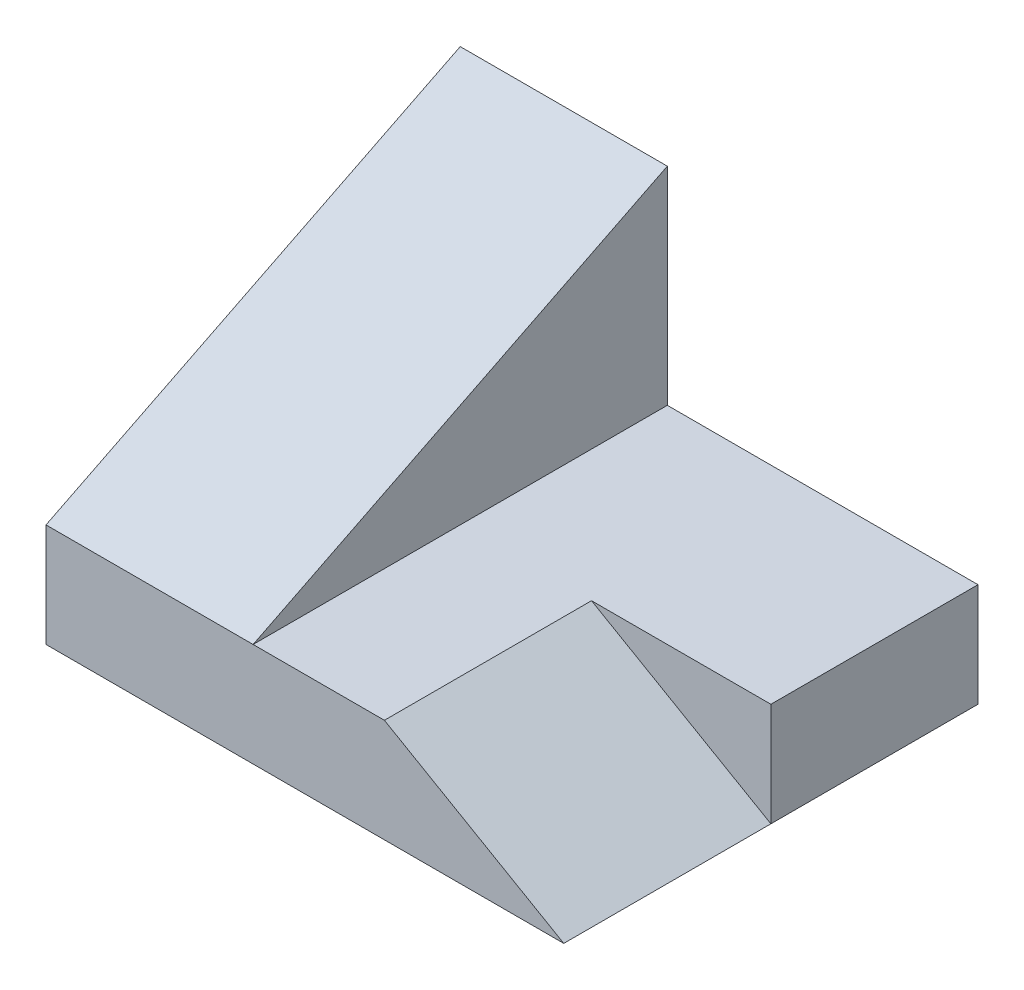
ISO-10303-21;
HEADER;
FILE_DESCRIPTION(('STEP AP214'),'2;1');
FILE_NAME('part.step','',(''),(''),'','','');
FILE_SCHEMA(('AUTOMOTIVE_DESIGN { 1 0 10303 214 1 1 1 1 }'));
ENDSEC;
DATA;
#1=APPLICATION_CONTEXT('core data for automotive mechanical design processes');
#2=APPLICATION_PROTOCOL_DEFINITION('international standard','automotive_design',2000,#1);
#3=PRODUCT_CONTEXT('',#1,'mechanical');
#4=PRODUCT('Part','Part','',(#3));
#5=PRODUCT_RELATED_PRODUCT_CATEGORY('part','',(#4));
#6=PRODUCT_DEFINITION_FORMATION('','',#4);
#7=PRODUCT_DEFINITION_CONTEXT('part definition',#1,'design');
#8=PRODUCT_DEFINITION('design','',#6,#7);
#9=PRODUCT_DEFINITION_SHAPE('','',#8);
#10=(LENGTH_UNIT() NAMED_UNIT(*) SI_UNIT(.MILLI.,.METRE.));
#11=(NAMED_UNIT(*) PLANE_ANGLE_UNIT() SI_UNIT($,.RADIAN.));
#12=(NAMED_UNIT(*) SI_UNIT($,.STERADIAN.) SOLID_ANGLE_UNIT());
#13=UNCERTAINTY_MEASURE_WITH_UNIT(LENGTH_MEASURE(1.E-05),#10,'distance_accuracy_value','');
#14=(GEOMETRIC_REPRESENTATION_CONTEXT(3) GLOBAL_UNCERTAINTY_ASSIGNED_CONTEXT((#13)) GLOBAL_UNIT_ASSIGNED_CONTEXT((#10,
#11,#12)) REPRESENTATION_CONTEXT('',''));
#15=CARTESIAN_POINT('',(0.,0.,0.));
#16=DIRECTION('',(0.,0.,1.));
#17=DIRECTION('',(1.,0.,0.));
#18=AXIS2_PLACEMENT_3D('',#15,#16,#17);
#19=CARTESIAN_POINT('',(25.,10.,-20.));
#20=DIRECTION('',(-1.,0.,0.));
#21=DIRECTION('',(0.,0.,1.));
#22=AXIS2_PLACEMENT_3D('',#19,#20,#21);
#23=PLANE('',#22);
#24=DIRECTION('',(0.,1.,0.));
#25=VECTOR('',#24,1.);
#26=CARTESIAN_POINT('',(25.,10.,0.));
#27=LINE('',#26,#25);
#28=CARTESIAN_POINT('',(25.,0.,0.));
#29=VERTEX_POINT('',#28);
#30=CARTESIAN_POINT('',(25.,10.,0.));
#31=VERTEX_POINT('',#30);
#32=EDGE_CURVE('E115',#29,#31,#27,.T.);
#33=ORIENTED_EDGE('',*,*,#32,.F.);
#34=DIRECTION('',(0.,0.,-1.));
#35=VECTOR('',#34,1.);
#36=CARTESIAN_POINT('',(25.,0.,-20.));
#37=LINE('',#36,#35);
#38=CARTESIAN_POINT('',(25.,0.,-20.));
#39=VERTEX_POINT('',#38);
#40=EDGE_CURVE('E105',#29,#39,#37,.T.);
#41=ORIENTED_EDGE('',*,*,#40,.T.);
#42=DIRECTION('',(0.,-1.,0.));
#43=VECTOR('',#42,1.);
#44=CARTESIAN_POINT('',(25.,10.,-20.));
#45=LINE('',#44,#43);
#46=CARTESIAN_POINT('',(25.,10.,-20.));
#47=VERTEX_POINT('',#46);
#48=EDGE_CURVE('E11',#47,#39,#45,.T.);
#49=ORIENTED_EDGE('',*,*,#48,.F.);
#50=DIRECTION('',(0.,0.,-1.));
#51=VECTOR('',#50,1.);
#52=CARTESIAN_POINT('',(25.,10.,-20.));
#53=LINE('',#52,#51);
#54=EDGE_CURVE('E52',#31,#47,#53,.T.);
#55=ORIENTED_EDGE('',*,*,#54,.F.);
#56=EDGE_LOOP('',(#33,#41,#49,#55));
#57=FACE_BOUND('',#56,.T.);
#58=ADVANCED_FACE('F37',(#57),#23,.F.);
#59=CARTESIAN_POINT('',(-25.,10.,-20.));
#60=DIRECTION('',(0.,0.,1.));
#61=DIRECTION('',(1.,0.,0.));
#62=AXIS2_PLACEMENT_3D('',#59,#60,#61);
#63=PLANE('',#62);
#64=DIRECTION('',(-1.,0.,0.));
#65=VECTOR('',#64,1.);
#66=CARTESIAN_POINT('',(-25.,0.,-20.));
#67=LINE('',#66,#65);
#68=CARTESIAN_POINT('',(-25.,0.,-20.));
#69=VERTEX_POINT('',#68);
#70=EDGE_CURVE('E93',#39,#69,#67,.T.);
#71=ORIENTED_EDGE('',*,*,#70,.T.);
#72=DIRECTION('',(0.,-1.,0.));
#73=VECTOR('',#72,1.);
#74=CARTESIAN_POINT('',(-25.,10.,-20.));
#75=LINE('',#74,#73);
#76=CARTESIAN_POINT('',(-25.,30.,-20.));
#77=VERTEX_POINT('',#76);
#78=EDGE_CURVE('E45',#77,#69,#75,.T.);
#79=ORIENTED_EDGE('',*,*,#78,.F.);
#80=DIRECTION('',(-1.,0.,0.));
#81=VECTOR('',#80,1.);
#82=CARTESIAN_POINT('',(-25.,30.,-20.));
#83=LINE('',#82,#81);
#84=CARTESIAN_POINT('',(-5.,30.,-20.));
#85=VERTEX_POINT('',#84);
#86=EDGE_CURVE('E126',#85,#77,#83,.T.);
#87=ORIENTED_EDGE('',*,*,#86,.F.);
#88=DIRECTION('',(0.,-1.,0.));
#89=VECTOR('',#88,1.);
#90=CARTESIAN_POINT('',(-5.,30.,-20.));
#91=LINE('',#90,#89);
#92=CARTESIAN_POINT('',(-5.,10.,-20.));
#93=VERTEX_POINT('',#92);
#94=EDGE_CURVE('E116',#85,#93,#91,.T.);
#95=ORIENTED_EDGE('',*,*,#94,.T.);
#96=DIRECTION('',(-1.,0.,0.));
#97=VECTOR('',#96,1.);
#98=CARTESIAN_POINT('',(-25.,10.,-20.));
#99=LINE('',#98,#97);
#100=EDGE_CURVE('E100',#47,#93,#99,.T.);
#101=ORIENTED_EDGE('',*,*,#100,.F.);
#102=ORIENTED_EDGE('',*,*,#48,.T.);
#103=EDGE_LOOP('',(#71,#79,#87,#95,#101,#102));
#104=FACE_BOUND('',#103,.T.);
#105=ADVANCED_FACE('F144',(#104),#63,.F.);
#106=CARTESIAN_POINT('',(-25.,10.,-20.));
#107=DIRECTION('',(1.,0.,0.));
#108=DIRECTION('',(0.,0.,-1.));
#109=AXIS2_PLACEMENT_3D('',#106,#107,#108);
#110=PLANE('',#109);
#111=DIRECTION('',(0.,-1.,0.));
#112=VECTOR('',#111,1.);
#113=CARTESIAN_POINT('',(-25.,10.,20.));
#114=LINE('',#113,#112);
#115=CARTESIAN_POINT('',(-25.,10.,20.));
#116=VERTEX_POINT('',#115);
#117=CARTESIAN_POINT('',(-25.,0.,20.));
#118=VERTEX_POINT('',#117);
#119=EDGE_CURVE('E71',#116,#118,#114,.T.);
#120=ORIENTED_EDGE('',*,*,#119,.F.);
#121=DIRECTION('',(0.,0.447213595499958,-0.894427190999916));
#122=VECTOR('',#121,1.);
#123=CARTESIAN_POINT('',(-25.,30.,-20.));
#124=LINE('',#123,#122);
#125=EDGE_CURVE('E133',#116,#77,#124,.T.);
#126=ORIENTED_EDGE('',*,*,#125,.T.);
#127=ORIENTED_EDGE('',*,*,#78,.T.);
#128=DIRECTION('',(0.,0.,1.));
#129=VECTOR('',#128,1.);
#130=CARTESIAN_POINT('',(-25.,0.,-20.));
#131=LINE('',#130,#129);
#132=EDGE_CURVE('E88',#69,#118,#131,.T.);
#133=ORIENTED_EDGE('',*,*,#132,.T.);
#134=EDGE_LOOP('',(#120,#126,#127,#133));
#135=FACE_BOUND('',#134,.T.);
#136=ADVANCED_FACE('F89',(#135),#110,.F.);
#137=CARTESIAN_POINT('',(-25.,10.,20.));
#138=DIRECTION('',(0.,0.,-1.));
#139=DIRECTION('',(-1.,0.,0.));
#140=AXIS2_PLACEMENT_3D('',#137,#138,#139);
#141=PLANE('',#140);
#142=DIRECTION('',(1.,0.,0.));
#143=VECTOR('',#142,1.);
#144=CARTESIAN_POINT('',(-25.,10.,20.));
#145=LINE('',#144,#143);
#146=CARTESIAN_POINT('',(-5.,10.,20.));
#147=VERTEX_POINT('',#146);
#148=CARTESIAN_POINT('',(7.67949192431123,10.,20.));
#149=VERTEX_POINT('',#148);
#150=EDGE_CURVE('E84',#147,#149,#145,.T.);
#151=ORIENTED_EDGE('',*,*,#150,.F.);
#152=DIRECTION('',(1.,0.,0.));
#153=VECTOR('',#152,1.);
#154=CARTESIAN_POINT('',(-25.,10.,20.));
#155=LINE('',#154,#153);
#156=EDGE_CURVE('E81',#116,#147,#155,.T.);
#157=ORIENTED_EDGE('',*,*,#156,.F.);
#158=ORIENTED_EDGE('',*,*,#119,.T.);
#159=DIRECTION('',(1.,0.,0.));
#160=VECTOR('',#159,1.);
#161=CARTESIAN_POINT('',(-25.,0.,20.));
#162=LINE('',#161,#160);
#163=CARTESIAN_POINT('',(25.,0.,20.));
#164=VERTEX_POINT('',#163);
#165=EDGE_CURVE('E77',#118,#164,#162,.T.);
#166=ORIENTED_EDGE('',*,*,#165,.T.);
#167=DIRECTION('',(0.866025403784439,-0.5,0.));
#168=VECTOR('',#167,1.);
#169=CARTESIAN_POINT('',(25.,0.,20.));
#170=LINE('',#169,#168);
#171=EDGE_CURVE('E113',#149,#164,#170,.T.);
#172=ORIENTED_EDGE('',*,*,#171,.F.);
#173=EDGE_LOOP('',(#151,#157,#158,#166,#172));
#174=FACE_BOUND('',#173,.T.);
#175=ADVANCED_FACE('F74',(#174),#141,.F.);
#176=CARTESIAN_POINT('',(0.,10.,0.));
#177=DIRECTION('',(0.,1.,0.));
#178=DIRECTION('',(0.,0.,1.));
#179=AXIS2_PLACEMENT_3D('',#176,#177,#178);
#180=PLANE('',#179);
#181=DIRECTION('',(0.,0.,-1.));
#182=VECTOR('',#181,1.);
#183=CARTESIAN_POINT('',(-5.,10.,-20.));
#184=LINE('',#183,#182);
#185=EDGE_CURVE('E127',#147,#93,#184,.T.);
#186=ORIENTED_EDGE('',*,*,#185,.F.);
#187=ORIENTED_EDGE('',*,*,#150,.T.);
#188=DIRECTION('',(0.,0.,1.));
#189=VECTOR('',#188,1.);
#190=CARTESIAN_POINT('',(7.67949192431123,10.,0.));
#191=LINE('',#190,#189);
#192=CARTESIAN_POINT('',(7.67949192431123,10.,0.));
#193=VERTEX_POINT('',#192);
#194=EDGE_CURVE('E109',#193,#149,#191,.T.);
#195=ORIENTED_EDGE('',*,*,#194,.F.);
#196=DIRECTION('',(-1.,0.,0.));
#197=VECTOR('',#196,1.);
#198=CARTESIAN_POINT('',(7.67949192431123,10.,0.));
#199=LINE('',#198,#197);
#200=EDGE_CURVE('E119',#31,#193,#199,.T.);
#201=ORIENTED_EDGE('',*,*,#200,.F.);
#202=ORIENTED_EDGE('',*,*,#54,.T.);
#203=ORIENTED_EDGE('',*,*,#100,.T.);
#204=EDGE_LOOP('',(#186,#187,#195,#201,#202,#203));
#205=FACE_BOUND('',#204,.T.);
#206=ADVANCED_FACE('F157',(#205),#180,.T.);
#207=CARTESIAN_POINT('',(0.,0.,0.));
#208=DIRECTION('',(0.,1.,0.));
#209=DIRECTION('',(0.,0.,1.));
#210=AXIS2_PLACEMENT_3D('',#207,#208,#209);
#211=PLANE('',#210);
#212=EDGE_CURVE('E98',#164,#29,#37,.T.);
#213=ORIENTED_EDGE('',*,*,#212,.F.);
#214=ORIENTED_EDGE('',*,*,#165,.F.);
#215=ORIENTED_EDGE('',*,*,#132,.F.);
#216=ORIENTED_EDGE('',*,*,#70,.F.);
#217=ORIENTED_EDGE('',*,*,#40,.F.);
#218=EDGE_LOOP('',(#213,#214,#215,#216,#217));
#219=FACE_BOUND('',#218,.T.);
#220=ADVANCED_FACE('F95',(#219),#211,.F.);
#221=CARTESIAN_POINT('',(25.,0.,0.));
#222=DIRECTION('',(-0.5,-0.866025403784439,0.));
#223=DIRECTION('',(0.866025403784439,-0.5,0.));
#224=AXIS2_PLACEMENT_3D('',#221,#222,#223);
#225=PLANE('',#224);
#226=ORIENTED_EDGE('',*,*,#171,.T.);
#227=ORIENTED_EDGE('',*,*,#212,.T.);
#228=DIRECTION('',(0.866025403784439,-0.5,0.));
#229=VECTOR('',#228,1.);
#230=CARTESIAN_POINT('',(25.,0.,0.));
#231=LINE('',#230,#229);
#232=EDGE_CURVE('E112',#193,#29,#231,.T.);
#233=ORIENTED_EDGE('',*,*,#232,.F.);
#234=ORIENTED_EDGE('',*,*,#194,.T.);
#235=EDGE_LOOP('',(#226,#227,#233,#234));
#236=FACE_BOUND('',#235,.T.);
#237=ADVANCED_FACE('F160',(#236),#225,.F.);
#238=CARTESIAN_POINT('',(0.,0.,0.));
#239=DIRECTION('',(0.,0.,1.));
#240=DIRECTION('',(1.,0.,0.));
#241=AXIS2_PLACEMENT_3D('',#238,#239,#240);
#242=PLANE('',#241);
#243=ORIENTED_EDGE('',*,*,#32,.T.);
#244=ORIENTED_EDGE('',*,*,#200,.T.);
#245=ORIENTED_EDGE('',*,*,#232,.T.);
#246=EDGE_LOOP('',(#243,#244,#245));
#247=FACE_BOUND('',#246,.T.);
#248=ADVANCED_FACE('F152',(#247),#242,.T.);
#249=CARTESIAN_POINT('',(-5.,30.,-20.));
#250=DIRECTION('',(-1.,0.,0.));
#251=DIRECTION('',(0.,0.,1.));
#252=AXIS2_PLACEMENT_3D('',#249,#250,#251);
#253=PLANE('',#252);
#254=ORIENTED_EDGE('',*,*,#94,.F.);
#255=DIRECTION('',(0.,0.447213595499958,-0.894427190999916));
#256=VECTOR('',#255,1.);
#257=CARTESIAN_POINT('',(-5.,30.,-20.));
#258=LINE('',#257,#256);
#259=EDGE_CURVE('E134',#147,#85,#258,.T.);
#260=ORIENTED_EDGE('',*,*,#259,.F.);
#261=ORIENTED_EDGE('',*,*,#185,.T.);
#262=EDGE_LOOP('',(#254,#260,#261));
#263=FACE_BOUND('',#262,.T.);
#264=ADVANCED_FACE('F169',(#263),#253,.F.);
#265=CARTESIAN_POINT('',(-25.,30.,-20.));
#266=DIRECTION('',(0.,-0.894427190999916,-0.447213595499958));
#267=DIRECTION('',(0.,0.447213595499958,-0.894427190999916));
#268=AXIS2_PLACEMENT_3D('',#265,#266,#267);
#269=PLANE('',#268);
#270=ORIENTED_EDGE('',*,*,#259,.T.);
#271=ORIENTED_EDGE('',*,*,#86,.T.);
#272=ORIENTED_EDGE('',*,*,#125,.F.);
#273=ORIENTED_EDGE('',*,*,#156,.T.);
#274=EDGE_LOOP('',(#270,#271,#272,#273));
#275=FACE_BOUND('',#274,.T.);
#276=ADVANCED_FACE('F170',(#275),#269,.F.);
#277=CLOSED_SHELL('',(#58,#105,#136,#175,#206,#220,#237,#248,#264,#276));
#278=MANIFOLD_SOLID_BREP('B2',#277);
#279=ADVANCED_BREP_SHAPE_REPRESENTATION('',(#18,#278),#14);
#280=SHAPE_DEFINITION_REPRESENTATION(#9,#279);
ENDSEC;
END-ISO-10303-21;
